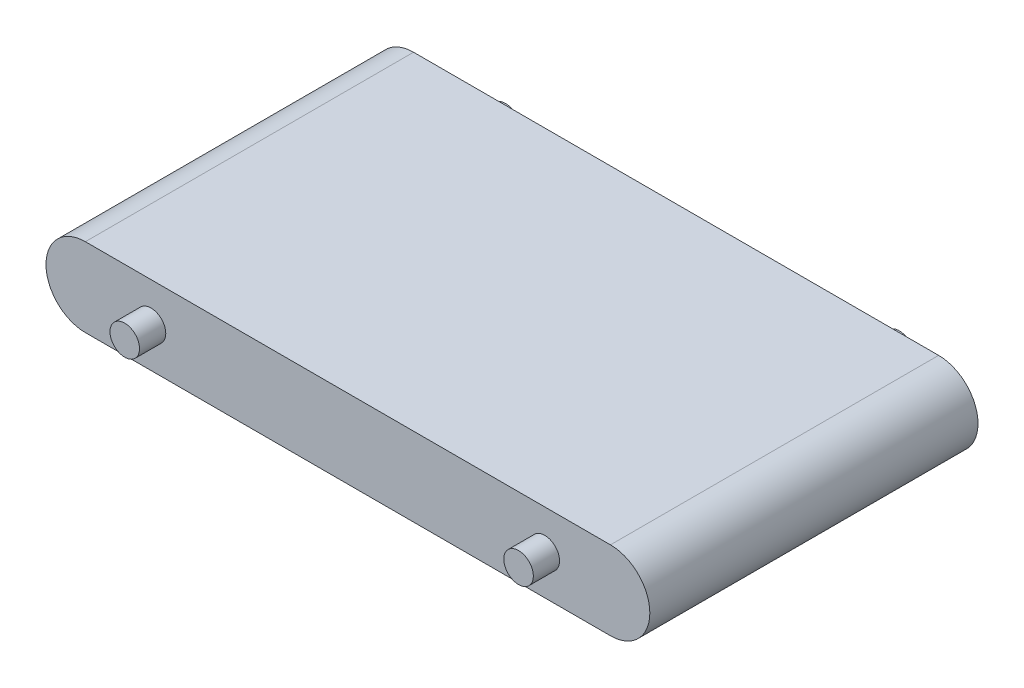
ISO-10303-21;
HEADER;
FILE_DESCRIPTION(('STEP AP214'),'2;1');
FILE_NAME('part.step','',(''),(''),'','','');
FILE_SCHEMA(('AUTOMOTIVE_DESIGN { 1 0 10303 214 1 1 1 1 }'));
ENDSEC;
DATA;
#1=APPLICATION_CONTEXT('core data for automotive mechanical design processes');
#2=APPLICATION_PROTOCOL_DEFINITION('international standard','automotive_design',2000,#1);
#3=PRODUCT_CONTEXT('',#1,'mechanical');
#4=PRODUCT('Part','Part','',(#3));
#5=PRODUCT_RELATED_PRODUCT_CATEGORY('part','',(#4));
#6=PRODUCT_DEFINITION_FORMATION('','',#4);
#7=PRODUCT_DEFINITION_CONTEXT('part definition',#1,'design');
#8=PRODUCT_DEFINITION('design','',#6,#7);
#9=PRODUCT_DEFINITION_SHAPE('','',#8);
#10=(LENGTH_UNIT() NAMED_UNIT(*) SI_UNIT(.MILLI.,.METRE.));
#11=(NAMED_UNIT(*) PLANE_ANGLE_UNIT() SI_UNIT($,.RADIAN.));
#12=(NAMED_UNIT(*) SI_UNIT($,.STERADIAN.) SOLID_ANGLE_UNIT());
#13=UNCERTAINTY_MEASURE_WITH_UNIT(LENGTH_MEASURE(1.E-05),#10,'distance_accuracy_value','');
#14=(GEOMETRIC_REPRESENTATION_CONTEXT(3) GLOBAL_UNCERTAINTY_ASSIGNED_CONTEXT((#13)) GLOBAL_UNIT_ASSIGNED_CONTEXT((#10,
#11,#12)) REPRESENTATION_CONTEXT('',''));
#15=CARTESIAN_POINT('',(0.,0.,0.));
#16=DIRECTION('',(0.,0.,1.));
#17=DIRECTION('',(1.,0.,0.));
#18=AXIS2_PLACEMENT_3D('',#15,#16,#17);
#19=CARTESIAN_POINT('',(200.,0.,125.));
#20=DIRECTION('',(0.,0.,-1.));
#21=DIRECTION('',(-1.,0.,0.));
#22=AXIS2_PLACEMENT_3D('',#19,#20,#21);
#23=CYLINDRICAL_SURFACE('',#22,30.);
#24=DIRECTION('',(0.,0.,-1.));
#25=VECTOR('',#24,1.);
#26=CARTESIAN_POINT('',(200.,30.,125.));
#27=LINE('',#26,#25);
#28=CARTESIAN_POINT('',(200.,30.,125.));
#29=VERTEX_POINT('',#28);
#30=CARTESIAN_POINT('',(200.,30.,-125.));
#31=VERTEX_POINT('',#30);
#32=EDGE_CURVE('E84',#29,#31,#27,.T.);
#33=ORIENTED_EDGE('',*,*,#32,.F.);
#34=CARTESIAN_POINT('',(200.,0.,125.));
#35=DIRECTION('',(0.,0.,1.));
#36=DIRECTION('',(1.,0.,0.));
#37=AXIS2_PLACEMENT_3D('',#34,#35,#36);
#38=CIRCLE('',#37,30.);
#39=CARTESIAN_POINT('',(200.,-30.,125.));
#40=VERTEX_POINT('',#39);
#41=EDGE_CURVE('E47',#40,#29,#38,.T.);
#42=ORIENTED_EDGE('',*,*,#41,.F.);
#43=DIRECTION('',(0.,0.,-1.));
#44=VECTOR('',#43,1.);
#45=CARTESIAN_POINT('',(200.,-30.,125.));
#46=LINE('',#45,#44);
#47=CARTESIAN_POINT('',(200.,-30.,-125.));
#48=VERTEX_POINT('',#47);
#49=EDGE_CURVE('E109',#48,#40,#46,.F.);
#50=ORIENTED_EDGE('',*,*,#49,.F.);
#51=CARTESIAN_POINT('',(200.,0.,-125.));
#52=DIRECTION('',(0.,0.,1.));
#53=DIRECTION('',(1.,0.,0.));
#54=AXIS2_PLACEMENT_3D('',#51,#52,#53);
#55=CIRCLE('',#54,30.);
#56=EDGE_CURVE('E11',#31,#48,#55,.F.);
#57=ORIENTED_EDGE('',*,*,#56,.F.);
#58=EDGE_LOOP('',(#33,#42,#50,#57));
#59=FACE_BOUND('',#58,.T.);
#60=ADVANCED_FACE('F39',(#59),#23,.T.);
#61=CARTESIAN_POINT('',(-200.,0.,-125.));
#62=DIRECTION('',(0.,0.,-1.));
#63=DIRECTION('',(-1.,0.,0.));
#64=AXIS2_PLACEMENT_3D('',#61,#62,#63);
#65=CYLINDRICAL_SURFACE('',#64,30.);
#66=DIRECTION('',(0.,0.,-1.));
#67=VECTOR('',#66,1.);
#68=CARTESIAN_POINT('',(-200.,30.,125.));
#69=LINE('',#68,#67);
#70=CARTESIAN_POINT('',(-200.,30.,-125.));
#71=VERTEX_POINT('',#70);
#72=CARTESIAN_POINT('',(-200.,30.,125.));
#73=VERTEX_POINT('',#72);
#74=EDGE_CURVE('E83',#71,#73,#69,.F.);
#75=ORIENTED_EDGE('',*,*,#74,.F.);
#76=CARTESIAN_POINT('',(-200.,0.,-125.));
#77=DIRECTION('',(0.,0.,1.));
#78=DIRECTION('',(1.,0.,0.));
#79=AXIS2_PLACEMENT_3D('',#76,#77,#78);
#80=CIRCLE('',#79,30.);
#81=CARTESIAN_POINT('',(-200.,-30.,-125.));
#82=VERTEX_POINT('',#81);
#83=EDGE_CURVE('E88',#82,#71,#80,.F.);
#84=ORIENTED_EDGE('',*,*,#83,.F.);
#85=DIRECTION('',(0.,0.,-1.));
#86=VECTOR('',#85,1.);
#87=CARTESIAN_POINT('',(-200.,-30.,125.));
#88=LINE('',#87,#86);
#89=CARTESIAN_POINT('',(-200.,-30.,125.));
#90=VERTEX_POINT('',#89);
#91=EDGE_CURVE('E95',#90,#82,#88,.T.);
#92=ORIENTED_EDGE('',*,*,#91,.F.);
#93=CARTESIAN_POINT('',(-200.,0.,125.));
#94=DIRECTION('',(0.,0.,1.));
#95=DIRECTION('',(1.,0.,0.));
#96=AXIS2_PLACEMENT_3D('',#93,#94,#95);
#97=CIRCLE('',#96,30.);
#98=EDGE_CURVE('E94',#73,#90,#97,.T.);
#99=ORIENTED_EDGE('',*,*,#98,.F.);
#100=EDGE_LOOP('',(#75,#84,#92,#99));
#101=FACE_BOUND('',#100,.T.);
#102=ADVANCED_FACE('F98',(#101),#65,.T.);
#103=CARTESIAN_POINT('',(-230.,30.,125.));
#104=DIRECTION('',(0.,-1.,0.));
#105=DIRECTION('',(0.,0.,-1.));
#106=AXIS2_PLACEMENT_3D('',#103,#104,#105);
#107=PLANE('',#106);
#108=DIRECTION('',(-1.,0.,0.));
#109=VECTOR('',#108,1.);
#110=CARTESIAN_POINT('',(-230.,30.,125.));
#111=LINE('',#110,#109);
#112=EDGE_CURVE('E103',#29,#73,#111,.T.);
#113=ORIENTED_EDGE('',*,*,#112,.F.);
#114=ORIENTED_EDGE('',*,*,#32,.T.);
#115=DIRECTION('',(-1.,0.,0.));
#116=VECTOR('',#115,1.);
#117=CARTESIAN_POINT('',(-230.,30.,-125.));
#118=LINE('',#117,#116);
#119=EDGE_CURVE('E78',#31,#71,#118,.T.);
#120=ORIENTED_EDGE('',*,*,#119,.T.);
#121=ORIENTED_EDGE('',*,*,#74,.T.);
#122=EDGE_LOOP('',(#113,#114,#120,#121));
#123=FACE_BOUND('',#122,.T.);
#124=ADVANCED_FACE('F81',(#123),#107,.F.);
#125=CARTESIAN_POINT('',(-230.,-30.,125.));
#126=DIRECTION('',(0.,1.,0.));
#127=DIRECTION('',(0.,0.,1.));
#128=AXIS2_PLACEMENT_3D('',#125,#126,#127);
#129=PLANE('',#128);
#130=DIRECTION('',(1.,0.,0.));
#131=VECTOR('',#130,1.);
#132=CARTESIAN_POINT('',(-230.,-30.,-125.));
#133=LINE('',#132,#131);
#134=EDGE_CURVE('E85',#82,#48,#133,.T.);
#135=ORIENTED_EDGE('',*,*,#134,.T.);
#136=ORIENTED_EDGE('',*,*,#49,.T.);
#137=DIRECTION('',(1.,0.,0.));
#138=VECTOR('',#137,1.);
#139=CARTESIAN_POINT('',(-230.,-30.,125.));
#140=LINE('',#139,#138);
#141=EDGE_CURVE('E99',#90,#40,#140,.T.);
#142=ORIENTED_EDGE('',*,*,#141,.F.);
#143=ORIENTED_EDGE('',*,*,#91,.T.);
#144=EDGE_LOOP('',(#135,#136,#142,#143));
#145=FACE_BOUND('',#144,.T.);
#146=ADVANCED_FACE('F157',(#145),#129,.F.);
#147=CARTESIAN_POINT('',(0.,0.,125.));
#148=DIRECTION('',(0.,0.,1.));
#149=DIRECTION('',(1.,0.,0.));
#150=AXIS2_PLACEMENT_3D('',#147,#148,#149);
#151=PLANE('',#150);
#152=CARTESIAN_POINT('',(150.,0.,125.));
#153=DIRECTION('',(0.,0.,1.));
#154=DIRECTION('',(1.,0.,0.));
#155=AXIS2_PLACEMENT_3D('',#152,#153,#154);
#156=CIRCLE('',#155,11.25);
#157=CARTESIAN_POINT('',(161.25,0.,125.));
#158=VERTEX_POINT('',#157);
#159=EDGE_CURVE('E121',#158,#158,#156,.T.);
#160=ORIENTED_EDGE('',*,*,#159,.F.);
#161=EDGE_LOOP('',(#160));
#162=FACE_BOUND('',#161,.T.);
#163=CARTESIAN_POINT('',(-150.,0.,125.));
#164=DIRECTION('',(0.,0.,1.));
#165=DIRECTION('',(1.,0.,0.));
#166=AXIS2_PLACEMENT_3D('',#163,#164,#165);
#167=CIRCLE('',#166,11.25);
#168=CARTESIAN_POINT('',(-138.75,0.,125.));
#169=VERTEX_POINT('',#168);
#170=EDGE_CURVE('E115',#169,#169,#167,.T.);
#171=ORIENTED_EDGE('',*,*,#170,.F.);
#172=EDGE_LOOP('',(#171));
#173=FACE_BOUND('',#172,.T.);
#174=ORIENTED_EDGE('',*,*,#141,.T.);
#175=ORIENTED_EDGE('',*,*,#41,.T.);
#176=ORIENTED_EDGE('',*,*,#112,.T.);
#177=ORIENTED_EDGE('',*,*,#98,.T.);
#178=EDGE_LOOP('',(#174,#175,#176,#177));
#179=FACE_BOUND('',#178,.T.);
#180=ADVANCED_FACE('F111',(#162,#173,#179),#151,.T.);
#181=CARTESIAN_POINT('',(0.,0.,-125.));
#182=DIRECTION('',(0.,0.,1.));
#183=DIRECTION('',(1.,0.,0.));
#184=AXIS2_PLACEMENT_3D('',#181,#182,#183);
#185=PLANE('',#184);
#186=CARTESIAN_POINT('',(150.,0.,-125.));
#187=DIRECTION('',(0.,0.,1.));
#188=DIRECTION('',(1.,0.,0.));
#189=AXIS2_PLACEMENT_3D('',#186,#187,#188);
#190=CIRCLE('',#189,11.25);
#191=CARTESIAN_POINT('',(161.25,0.,-125.));
#192=VERTEX_POINT('',#191);
#193=EDGE_CURVE('E133',#192,#192,#190,.T.);
#194=ORIENTED_EDGE('',*,*,#193,.T.);
#195=EDGE_LOOP('',(#194));
#196=FACE_BOUND('',#195,.T.);
#197=CARTESIAN_POINT('',(-150.,0.,-125.));
#198=DIRECTION('',(0.,0.,1.));
#199=DIRECTION('',(1.,0.,0.));
#200=AXIS2_PLACEMENT_3D('',#197,#198,#199);
#201=CIRCLE('',#200,11.25);
#202=CARTESIAN_POINT('',(-138.75,0.,-125.));
#203=VERTEX_POINT('',#202);
#204=EDGE_CURVE('E127',#203,#203,#201,.T.);
#205=ORIENTED_EDGE('',*,*,#204,.T.);
#206=EDGE_LOOP('',(#205));
#207=FACE_BOUND('',#206,.T.);
#208=ORIENTED_EDGE('',*,*,#119,.F.);
#209=ORIENTED_EDGE('',*,*,#56,.T.);
#210=ORIENTED_EDGE('',*,*,#134,.F.);
#211=ORIENTED_EDGE('',*,*,#83,.T.);
#212=EDGE_LOOP('',(#208,#209,#210,#211));
#213=FACE_BOUND('',#212,.T.);
#214=ADVANCED_FACE('F89',(#196,#207,#213),#185,.F.);
#215=CARTESIAN_POINT('',(-150.,0.,145.));
#216=DIRECTION('',(0.,0.,-1.));
#217=DIRECTION('',(-1.,0.,0.));
#218=AXIS2_PLACEMENT_3D('',#215,#216,#217);
#219=CYLINDRICAL_SURFACE('',#218,11.25);
#220=CARTESIAN_POINT('',(-150.,0.,145.));
#221=DIRECTION('',(0.,0.,1.));
#222=DIRECTION('',(1.,0.,0.));
#223=AXIS2_PLACEMENT_3D('',#220,#221,#222);
#224=CIRCLE('',#223,11.25);
#225=CARTESIAN_POINT('',(-138.75,0.,145.));
#226=VERTEX_POINT('',#225);
#227=EDGE_CURVE('E86',#226,#226,#224,.T.);
#228=ORIENTED_EDGE('',*,*,#227,.F.);
#229=EDGE_LOOP('',(#228));
#230=FACE_BOUND('',#229,.T.);
#231=ORIENTED_EDGE('',*,*,#170,.T.);
#232=EDGE_LOOP('',(#231));
#233=FACE_BOUND('',#232,.T.);
#234=ADVANCED_FACE('F168',(#230,#233),#219,.T.);
#235=CARTESIAN_POINT('',(-150.,0.,145.));
#236=DIRECTION('',(0.,0.,1.));
#237=DIRECTION('',(1.,0.,0.));
#238=AXIS2_PLACEMENT_3D('',#235,#236,#237);
#239=PLANE('',#238);
#240=ORIENTED_EDGE('',*,*,#227,.T.);
#241=EDGE_LOOP('',(#240));
#242=FACE_BOUND('',#241,.T.);
#243=ADVANCED_FACE('F175',(#242),#239,.T.);
#244=CARTESIAN_POINT('',(150.,0.,145.));
#245=DIRECTION('',(0.,0.,-1.));
#246=DIRECTION('',(-1.,0.,0.));
#247=AXIS2_PLACEMENT_3D('',#244,#245,#246);
#248=CYLINDRICAL_SURFACE('',#247,11.25);
#249=CARTESIAN_POINT('',(150.,0.,145.));
#250=DIRECTION('',(0.,0.,1.));
#251=DIRECTION('',(1.,0.,0.));
#252=AXIS2_PLACEMENT_3D('',#249,#250,#251);
#253=CIRCLE('',#252,11.25);
#254=CARTESIAN_POINT('',(161.25,0.,145.));
#255=VERTEX_POINT('',#254);
#256=EDGE_CURVE('E118',#255,#255,#253,.T.);
#257=ORIENTED_EDGE('',*,*,#256,.F.);
#258=EDGE_LOOP('',(#257));
#259=FACE_BOUND('',#258,.T.);
#260=ORIENTED_EDGE('',*,*,#159,.T.);
#261=EDGE_LOOP('',(#260));
#262=FACE_BOUND('',#261,.T.);
#263=ADVANCED_FACE('F179',(#259,#262),#248,.T.);
#264=CARTESIAN_POINT('',(150.,0.,145.));
#265=DIRECTION('',(0.,0.,1.));
#266=DIRECTION('',(1.,0.,0.));
#267=AXIS2_PLACEMENT_3D('',#264,#265,#266);
#268=PLANE('',#267);
#269=ORIENTED_EDGE('',*,*,#256,.T.);
#270=EDGE_LOOP('',(#269));
#271=FACE_BOUND('',#270,.T.);
#272=ADVANCED_FACE('F183',(#271),#268,.T.);
#273=CARTESIAN_POINT('',(-150.,0.,-145.));
#274=DIRECTION('',(0.,0.,1.));
#275=DIRECTION('',(1.,0.,0.));
#276=AXIS2_PLACEMENT_3D('',#273,#274,#275);
#277=CYLINDRICAL_SURFACE('',#276,11.25);
#278=CARTESIAN_POINT('',(-150.,0.,-145.));
#279=DIRECTION('',(0.,0.,1.));
#280=DIRECTION('',(1.,0.,0.));
#281=AXIS2_PLACEMENT_3D('',#278,#279,#280);
#282=CIRCLE('',#281,11.25);
#283=CARTESIAN_POINT('',(-138.75,0.,-145.));
#284=VERTEX_POINT('',#283);
#285=EDGE_CURVE('E124',#284,#284,#282,.T.);
#286=ORIENTED_EDGE('',*,*,#285,.T.);
#287=EDGE_LOOP('',(#286));
#288=FACE_BOUND('',#287,.T.);
#289=ORIENTED_EDGE('',*,*,#204,.F.);
#290=EDGE_LOOP('',(#289));
#291=FACE_BOUND('',#290,.T.);
#292=ADVANCED_FACE('F187',(#288,#291),#277,.T.);
#293=CARTESIAN_POINT('',(-150.,0.,-145.));
#294=DIRECTION('',(0.,0.,-1.));
#295=DIRECTION('',(1.,0.,0.));
#296=AXIS2_PLACEMENT_3D('',#293,#294,#295);
#297=PLANE('',#296);
#298=ORIENTED_EDGE('',*,*,#285,.F.);
#299=EDGE_LOOP('',(#298));
#300=FACE_BOUND('',#299,.T.);
#301=ADVANCED_FACE('F148',(#300),#297,.T.);
#302=CARTESIAN_POINT('',(150.,0.,-145.));
#303=DIRECTION('',(0.,0.,1.));
#304=DIRECTION('',(1.,0.,0.));
#305=AXIS2_PLACEMENT_3D('',#302,#303,#304);
#306=CYLINDRICAL_SURFACE('',#305,11.25);
#307=CARTESIAN_POINT('',(150.,0.,-145.));
#308=DIRECTION('',(0.,0.,1.));
#309=DIRECTION('',(1.,0.,0.));
#310=AXIS2_PLACEMENT_3D('',#307,#308,#309);
#311=CIRCLE('',#310,11.25);
#312=CARTESIAN_POINT('',(161.25,0.,-145.));
#313=VERTEX_POINT('',#312);
#314=EDGE_CURVE('E130',#313,#313,#311,.T.);
#315=ORIENTED_EDGE('',*,*,#314,.T.);
#316=EDGE_LOOP('',(#315));
#317=FACE_BOUND('',#316,.T.);
#318=ORIENTED_EDGE('',*,*,#193,.F.);
#319=EDGE_LOOP('',(#318));
#320=FACE_BOUND('',#319,.T.);
#321=ADVANCED_FACE('F139',(#317,#320),#306,.T.);
#322=CARTESIAN_POINT('',(150.,0.,-145.));
#323=DIRECTION('',(0.,0.,-1.));
#324=DIRECTION('',(1.,0.,0.));
#325=AXIS2_PLACEMENT_3D('',#322,#323,#324);
#326=PLANE('',#325);
#327=ORIENTED_EDGE('',*,*,#314,.F.);
#328=EDGE_LOOP('',(#327));
#329=FACE_BOUND('',#328,.T.);
#330=ADVANCED_FACE('F142',(#329),#326,.T.);
#331=CLOSED_SHELL('',(#60,#102,#124,#146,#180,#214,#234,#243,#263,#272,#292,#301,#321,#330));
#332=MANIFOLD_SOLID_BREP('B2',#331);
#333=ADVANCED_BREP_SHAPE_REPRESENTATION('',(#18,#332),#14);
#334=SHAPE_DEFINITION_REPRESENTATION(#9,#333);
ENDSEC;
END-ISO-10303-21;
